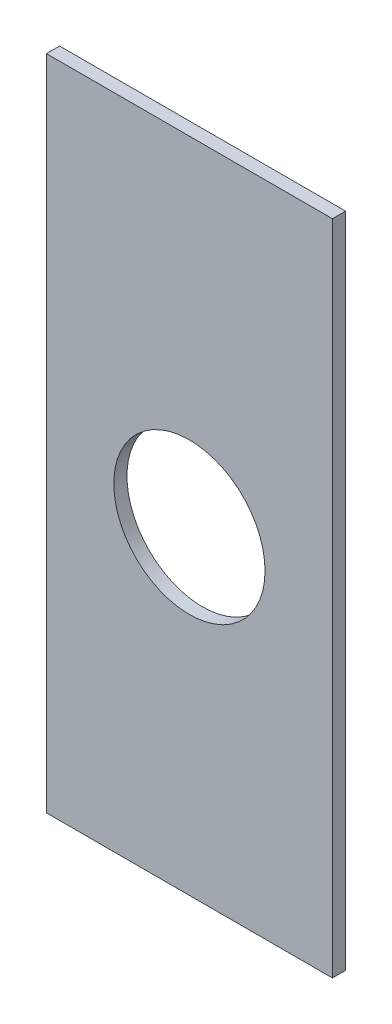
ISO-10303-21;
HEADER;
FILE_DESCRIPTION(('STEP AP214'),'2;1');
FILE_NAME('part.step','',(''),(''),'','','');
FILE_SCHEMA(('AUTOMOTIVE_DESIGN { 1 0 10303 214 1 1 1 1 }'));
ENDSEC;
DATA;
#1=APPLICATION_CONTEXT('core data for automotive mechanical design processes');
#2=APPLICATION_PROTOCOL_DEFINITION('international standard','automotive_design',2000,#1);
#3=PRODUCT_CONTEXT('',#1,'mechanical');
#4=PRODUCT('Part','Part','',(#3));
#5=PRODUCT_RELATED_PRODUCT_CATEGORY('part','',(#4));
#6=PRODUCT_DEFINITION_FORMATION('','',#4);
#7=PRODUCT_DEFINITION_CONTEXT('part definition',#1,'design');
#8=PRODUCT_DEFINITION('design','',#6,#7);
#9=PRODUCT_DEFINITION_SHAPE('','',#8);
#10=(LENGTH_UNIT() NAMED_UNIT(*) SI_UNIT(.MILLI.,.METRE.));
#11=(NAMED_UNIT(*) PLANE_ANGLE_UNIT() SI_UNIT($,.RADIAN.));
#12=(NAMED_UNIT(*) SI_UNIT($,.STERADIAN.) SOLID_ANGLE_UNIT());
#13=UNCERTAINTY_MEASURE_WITH_UNIT(LENGTH_MEASURE(1.E-05),#10,'distance_accuracy_value','');
#14=(GEOMETRIC_REPRESENTATION_CONTEXT(3) GLOBAL_UNCERTAINTY_ASSIGNED_CONTEXT((#13)) GLOBAL_UNIT_ASSIGNED_CONTEXT((#10,
#11,#12)) REPRESENTATION_CONTEXT('',''));
#15=CARTESIAN_POINT('',(0.,0.,0.));
#16=DIRECTION('',(0.,0.,1.));
#17=DIRECTION('',(1.,0.,0.));
#18=AXIS2_PLACEMENT_3D('',#15,#16,#17);
#19=CARTESIAN_POINT('',(0.,0.,4.));
#20=DIRECTION('',(0.,0.,1.));
#21=DIRECTION('',(1.,0.,0.));
#22=AXIS2_PLACEMENT_3D('',#19,#20,#21);
#23=PLANE('',#22);
#24=DIRECTION('',(-1.,0.,0.));
#25=VECTOR('',#24,1.);
#26=CARTESIAN_POINT('',(-43.5,50.,4.));
#27=LINE('',#26,#25);
#28=CARTESIAN_POINT('',(43.5,50.,4.));
#29=VERTEX_POINT('',#28);
#30=CARTESIAN_POINT('',(-43.5,50.,4.));
#31=VERTEX_POINT('',#30);
#32=EDGE_CURVE('E83',#29,#31,#27,.T.);
#33=ORIENTED_EDGE('',*,*,#32,.T.);
#34=DIRECTION('',(0.,-1.,0.));
#35=VECTOR('',#34,1.);
#36=CARTESIAN_POINT('',(-43.5,-50.,4.));
#37=LINE('',#36,#35);
#38=CARTESIAN_POINT('',(-43.5,-150.,4.));
#39=VERTEX_POINT('',#38);
#40=EDGE_CURVE('E78',#31,#39,#37,.T.);
#41=ORIENTED_EDGE('',*,*,#40,.T.);
#42=DIRECTION('',(1.,0.,0.));
#43=VECTOR('',#42,1.);
#44=CARTESIAN_POINT('',(-43.5,-150.,4.));
#45=LINE('',#44,#43);
#46=CARTESIAN_POINT('',(43.5,-150.,4.));
#47=VERTEX_POINT('',#46);
#48=EDGE_CURVE('E81',#39,#47,#45,.T.);
#49=ORIENTED_EDGE('',*,*,#48,.T.);
#50=DIRECTION('',(0.,1.,0.));
#51=VECTOR('',#50,1.);
#52=CARTESIAN_POINT('',(43.5,-50.,4.));
#53=LINE('',#52,#51);
#54=EDGE_CURVE('E52',#47,#29,#53,.T.);
#55=ORIENTED_EDGE('',*,*,#54,.T.);
#56=EDGE_LOOP('',(#33,#41,#49,#55));
#57=FACE_BOUND('',#56,.T.);
#58=CARTESIAN_POINT('',(0.,-53.,4.));
#59=DIRECTION('',(0.,0.,1.));
#60=DIRECTION('',(1.,0.,0.));
#61=AXIS2_PLACEMENT_3D('',#58,#59,#60);
#62=CIRCLE('',#61,23.);
#63=CARTESIAN_POINT('',(23.,-53.,4.));
#64=VERTEX_POINT('',#63);
#65=EDGE_CURVE('E100',#64,#64,#62,.T.);
#66=ORIENTED_EDGE('',*,*,#65,.F.);
#67=EDGE_LOOP('',(#66));
#68=FACE_BOUND('',#67,.T.);
#69=ADVANCED_FACE('F35',(#57,#68),#23,.T.);
#70=CARTESIAN_POINT('',(0.,0.,0.));
#71=DIRECTION('',(0.,0.,1.));
#72=DIRECTION('',(1.,0.,0.));
#73=AXIS2_PLACEMENT_3D('',#70,#71,#72);
#74=PLANE('',#73);
#75=DIRECTION('',(0.,-1.,0.));
#76=VECTOR('',#75,1.);
#77=CARTESIAN_POINT('',(-43.5,-50.,0.));
#78=LINE('',#77,#76);
#79=CARTESIAN_POINT('',(-43.5,50.,0.));
#80=VERTEX_POINT('',#79);
#81=CARTESIAN_POINT('',(-43.5,-150.,0.));
#82=VERTEX_POINT('',#81);
#83=EDGE_CURVE('E88',#80,#82,#78,.T.);
#84=ORIENTED_EDGE('',*,*,#83,.F.);
#85=DIRECTION('',(-1.,0.,0.));
#86=VECTOR('',#85,1.);
#87=CARTESIAN_POINT('',(-37.5,50.,0.));
#88=LINE('',#87,#86);
#89=CARTESIAN_POINT('',(43.5,50.,0.));
#90=VERTEX_POINT('',#89);
#91=EDGE_CURVE('E72',#90,#80,#88,.T.);
#92=ORIENTED_EDGE('',*,*,#91,.F.);
#93=DIRECTION('',(0.,1.,0.));
#94=VECTOR('',#93,1.);
#95=CARTESIAN_POINT('',(43.5,-50.,0.));
#96=LINE('',#95,#94);
#97=CARTESIAN_POINT('',(43.5,-150.,0.));
#98=VERTEX_POINT('',#97);
#99=EDGE_CURVE('E68',#98,#90,#96,.T.);
#100=ORIENTED_EDGE('',*,*,#99,.F.);
#101=DIRECTION('',(1.,0.,0.));
#102=VECTOR('',#101,1.);
#103=CARTESIAN_POINT('',(43.5,-150.,0.));
#104=LINE('',#103,#102);
#105=EDGE_CURVE('E99',#82,#98,#104,.T.);
#106=ORIENTED_EDGE('',*,*,#105,.F.);
#107=EDGE_LOOP('',(#84,#92,#100,#106));
#108=FACE_BOUND('',#107,.T.);
#109=CARTESIAN_POINT('',(0.,-53.,0.));
#110=DIRECTION('',(0.,0.,1.));
#111=DIRECTION('',(1.,0.,0.));
#112=AXIS2_PLACEMENT_3D('',#109,#110,#111);
#113=CIRCLE('',#112,23.);
#114=CARTESIAN_POINT('',(23.,-53.,0.));
#115=VERTEX_POINT('',#114);
#116=EDGE_CURVE('E112',#115,#115,#113,.T.);
#117=ORIENTED_EDGE('',*,*,#116,.T.);
#118=EDGE_LOOP('',(#117));
#119=FACE_BOUND('',#118,.T.);
#120=ADVANCED_FACE('F121',(#108,#119),#74,.F.);
#121=CARTESIAN_POINT('',(-43.5,-50.,4.));
#122=DIRECTION('',(1.,0.,0.));
#123=DIRECTION('',(0.,1.,0.));
#124=AXIS2_PLACEMENT_3D('',#121,#122,#123);
#125=PLANE('',#124);
#126=ORIENTED_EDGE('',*,*,#83,.T.);
#127=DIRECTION('',(0.,0.,-1.));
#128=VECTOR('',#127,1.);
#129=CARTESIAN_POINT('',(-43.5,-150.,4.));
#130=LINE('',#129,#128);
#131=EDGE_CURVE('E44',#39,#82,#130,.T.);
#132=ORIENTED_EDGE('',*,*,#131,.F.);
#133=ORIENTED_EDGE('',*,*,#40,.F.);
#134=DIRECTION('',(0.,0.,-1.));
#135=VECTOR('',#134,1.);
#136=CARTESIAN_POINT('',(-43.5,50.,4.));
#137=LINE('',#136,#135);
#138=EDGE_CURVE('E11',#31,#80,#137,.T.);
#139=ORIENTED_EDGE('',*,*,#138,.T.);
#140=EDGE_LOOP('',(#126,#132,#133,#139));
#141=FACE_BOUND('',#140,.T.);
#142=ADVANCED_FACE('F37',(#141),#125,.F.);
#143=CARTESIAN_POINT('',(43.5,-150.,4.));
#144=DIRECTION('',(0.,1.,0.));
#145=DIRECTION('',(0.,0.,1.));
#146=AXIS2_PLACEMENT_3D('',#143,#144,#145);
#147=PLANE('',#146);
#148=ORIENTED_EDGE('',*,*,#105,.T.);
#149=DIRECTION('',(0.,0.,-1.));
#150=VECTOR('',#149,1.);
#151=CARTESIAN_POINT('',(43.5,-150.,4.));
#152=LINE('',#151,#150);
#153=EDGE_CURVE('E90',#47,#98,#152,.T.);
#154=ORIENTED_EDGE('',*,*,#153,.F.);
#155=ORIENTED_EDGE('',*,*,#48,.F.);
#156=ORIENTED_EDGE('',*,*,#131,.T.);
#157=EDGE_LOOP('',(#148,#154,#155,#156));
#158=FACE_BOUND('',#157,.T.);
#159=ADVANCED_FACE('F91',(#158),#147,.F.);
#160=CARTESIAN_POINT('',(43.5,-50.,4.));
#161=DIRECTION('',(-1.,0.,0.));
#162=DIRECTION('',(0.,0.,1.));
#163=AXIS2_PLACEMENT_3D('',#160,#161,#162);
#164=PLANE('',#163);
#165=ORIENTED_EDGE('',*,*,#99,.T.);
#166=DIRECTION('',(0.,0.,-1.));
#167=VECTOR('',#166,1.);
#168=CARTESIAN_POINT('',(43.5,50.,4.));
#169=LINE('',#168,#167);
#170=EDGE_CURVE('E94',#29,#90,#169,.T.);
#171=ORIENTED_EDGE('',*,*,#170,.F.);
#172=ORIENTED_EDGE('',*,*,#54,.F.);
#173=ORIENTED_EDGE('',*,*,#153,.T.);
#174=EDGE_LOOP('',(#165,#171,#172,#173));
#175=FACE_BOUND('',#174,.T.);
#176=ADVANCED_FACE('F107',(#175),#164,.F.);
#177=CARTESIAN_POINT('',(-37.5,50.,4.));
#178=DIRECTION('',(0.,-1.,0.));
#179=DIRECTION('',(0.,0.,-1.));
#180=AXIS2_PLACEMENT_3D('',#177,#178,#179);
#181=PLANE('',#180);
#182=ORIENTED_EDGE('',*,*,#91,.T.);
#183=ORIENTED_EDGE('',*,*,#138,.F.);
#184=ORIENTED_EDGE('',*,*,#32,.F.);
#185=ORIENTED_EDGE('',*,*,#170,.T.);
#186=EDGE_LOOP('',(#182,#183,#184,#185));
#187=FACE_BOUND('',#186,.T.);
#188=ADVANCED_FACE('F110',(#187),#181,.F.);
#189=CARTESIAN_POINT('',(0.,-53.,4.));
#190=DIRECTION('',(0.,0.,-1.));
#191=DIRECTION('',(-1.,0.,0.));
#192=AXIS2_PLACEMENT_3D('',#189,#190,#191);
#193=CYLINDRICAL_SURFACE('',#192,23.);
#194=ORIENTED_EDGE('',*,*,#65,.T.);
#195=EDGE_LOOP('',(#194));
#196=FACE_BOUND('',#195,.T.);
#197=ORIENTED_EDGE('',*,*,#116,.F.);
#198=EDGE_LOOP('',(#197));
#199=FACE_BOUND('',#198,.T.);
#200=ADVANCED_FACE('F118',(#196,#199),#193,.F.);
#201=CLOSED_SHELL('',(#69,#120,#142,#159,#176,#188,#200));
#202=MANIFOLD_SOLID_BREP('B2',#201);
#203=ADVANCED_BREP_SHAPE_REPRESENTATION('',(#18,#202),#14);
#204=SHAPE_DEFINITION_REPRESENTATION(#9,#203);
ENDSEC;
END-ISO-10303-21;
